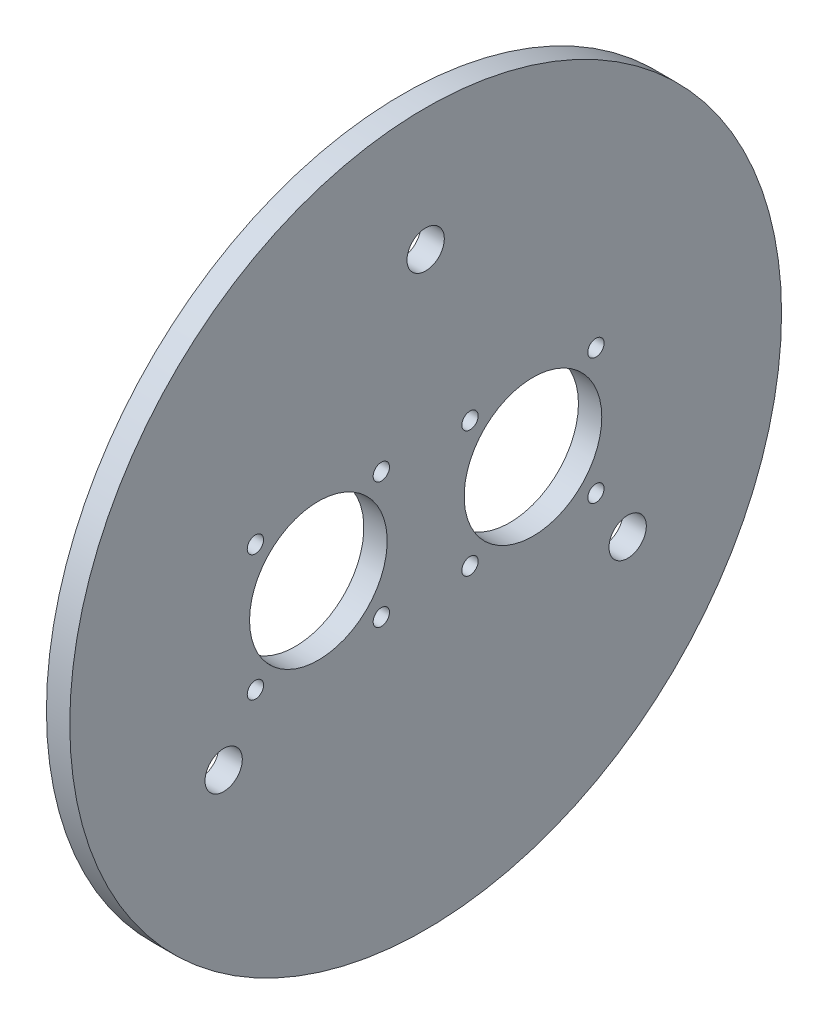
ISO-10303-21;
HEADER;
FILE_DESCRIPTION(('STEP AP214'),'2;1');
FILE_NAME('part.step','',(''),(''),'','','');
FILE_SCHEMA(('AUTOMOTIVE_DESIGN { 1 0 10303 214 1 1 1 1 }'));
ENDSEC;
DATA;
#1=APPLICATION_CONTEXT('core data for automotive mechanical design processes');
#2=APPLICATION_PROTOCOL_DEFINITION('international standard','automotive_design',2000,#1);
#3=PRODUCT_CONTEXT('',#1,'mechanical');
#4=PRODUCT('Part','Part','',(#3));
#5=PRODUCT_RELATED_PRODUCT_CATEGORY('part','',(#4));
#6=PRODUCT_DEFINITION_FORMATION('','',#4);
#7=PRODUCT_DEFINITION_CONTEXT('part definition',#1,'design');
#8=PRODUCT_DEFINITION('design','',#6,#7);
#9=PRODUCT_DEFINITION_SHAPE('','',#8);
#10=(LENGTH_UNIT() NAMED_UNIT(*) SI_UNIT(.MILLI.,.METRE.));
#11=(NAMED_UNIT(*) PLANE_ANGLE_UNIT() SI_UNIT($,.RADIAN.));
#12=(NAMED_UNIT(*) SI_UNIT($,.STERADIAN.) SOLID_ANGLE_UNIT());
#13=UNCERTAINTY_MEASURE_WITH_UNIT(LENGTH_MEASURE(1.E-05),#10,'distance_accuracy_value','');
#14=(GEOMETRIC_REPRESENTATION_CONTEXT(3) GLOBAL_UNCERTAINTY_ASSIGNED_CONTEXT((#13)) GLOBAL_UNIT_ASSIGNED_CONTEXT((#10,
#11,#12)) REPRESENTATION_CONTEXT('',''));
#15=CARTESIAN_POINT('',(0.,0.,0.));
#16=DIRECTION('',(0.,0.,1.));
#17=DIRECTION('',(1.,0.,0.));
#18=AXIS2_PLACEMENT_3D('',#15,#16,#17);
#19=CARTESIAN_POINT('',(5.,0.,0.));
#20=DIRECTION('',(1.,0.,0.));
#21=DIRECTION('',(0.,0.,-1.));
#22=AXIS2_PLACEMENT_3D('',#19,#20,#21);
#23=PLANE('',#22);
#24=CARTESIAN_POINT('',(5.,13.4969006858982,9.50309931410175));
#25=DIRECTION('',(1.,0.,0.));
#26=DIRECTION('',(0.,0.,1.));
#27=AXIS2_PLACEMENT_3D('',#24,#25,#26);
#28=CIRCLE('',#27,1.75000000000001);
#29=CARTESIAN_POINT('',(5.,13.4969006858982,11.2530993141018));
#30=VERTEX_POINT('',#29);
#31=EDGE_CURVE('E107',#30,#30,#28,.T.);
#32=ORIENTED_EDGE('',*,*,#31,.F.);
#33=EDGE_LOOP('',(#32));
#34=FACE_BOUND('',#33,.T.);
#35=CARTESIAN_POINT('',(5.,13.4969006858982,-9.50309931410175));
#36=DIRECTION('',(1.,0.,0.));
#37=DIRECTION('',(0.,0.,-1.));
#38=AXIS2_PLACEMENT_3D('',#35,#36,#37);
#39=CIRCLE('',#38,1.75000000000001);
#40=CARTESIAN_POINT('',(5.,13.4969006858982,-11.2530993141018));
#41=VERTEX_POINT('',#40);
#42=EDGE_CURVE('E95',#41,#41,#39,.T.);
#43=ORIENTED_EDGE('',*,*,#42,.F.);
#44=EDGE_LOOP('',(#43));
#45=FACE_BOUND('',#44,.T.);
#46=CARTESIAN_POINT('',(5.,-13.4969006858982,-36.4969006858983));
#47=DIRECTION('',(1.,0.,0.));
#48=DIRECTION('',(0.,0.,-1.));
#49=AXIS2_PLACEMENT_3D('',#46,#47,#48);
#50=CIRCLE('',#49,1.75);
#51=CARTESIAN_POINT('',(5.,-13.4969006858982,-38.2469006858983));
#52=VERTEX_POINT('',#51);
#53=EDGE_CURVE('E83',#52,#52,#50,.T.);
#54=ORIENTED_EDGE('',*,*,#53,.F.);
#55=EDGE_LOOP('',(#54));
#56=FACE_BOUND('',#55,.T.);
#57=CARTESIAN_POINT('',(5.,13.4969006858983,-36.4969006858982));
#58=DIRECTION('',(1.,0.,0.));
#59=DIRECTION('',(0.,0.,-1.));
#60=AXIS2_PLACEMENT_3D('',#57,#58,#59);
#61=CIRCLE('',#60,1.75);
#62=CARTESIAN_POINT('',(5.,13.4969006858983,-38.2469006858982));
#63=VERTEX_POINT('',#62);
#64=EDGE_CURVE('E71',#63,#63,#61,.T.);
#65=ORIENTED_EDGE('',*,*,#64,.F.);
#66=EDGE_LOOP('',(#65));
#67=FACE_BOUND('',#66,.T.);
#68=CARTESIAN_POINT('',(5.,0.,-23.));
#69=DIRECTION('',(1.,0.,0.));
#70=DIRECTION('',(0.,0.,-1.));
#71=AXIS2_PLACEMENT_3D('',#68,#69,#70);
#72=CIRCLE('',#71,14.75);
#73=CARTESIAN_POINT('',(5.,0.,-37.75));
#74=VERTEX_POINT('',#73);
#75=EDGE_CURVE('E59',#74,#74,#72,.T.);
#76=ORIENTED_EDGE('',*,*,#75,.F.);
#77=EDGE_LOOP('',(#76));
#78=FACE_BOUND('',#77,.T.);
#79=CARTESIAN_POINT('',(5.,-25.,-43.3012701892219));
#80=DIRECTION('',(1.,0.,0.));
#81=DIRECTION('',(0.,0.,-1.));
#82=AXIS2_PLACEMENT_3D('',#79,#80,#81);
#83=CIRCLE('',#82,4.00000000000001);
#84=CARTESIAN_POINT('',(5.,-25.,-47.301270189222));
#85=VERTEX_POINT('',#84);
#86=EDGE_CURVE('E47',#85,#85,#83,.T.);
#87=ORIENTED_EDGE('',*,*,#86,.F.);
#88=EDGE_LOOP('',(#87));
#89=FACE_BOUND('',#88,.T.);
#90=CARTESIAN_POINT('',(5.,0.,0.));
#91=DIRECTION('',(1.,0.,0.));
#92=DIRECTION('',(0.,0.,-1.));
#93=AXIS2_PLACEMENT_3D('',#90,#91,#92);
#94=CIRCLE('',#93,76.29);
#95=CARTESIAN_POINT('',(5.,0.,-76.29));
#96=VERTEX_POINT('',#95);
#97=EDGE_CURVE('E10',#96,#96,#94,.T.);
#98=ORIENTED_EDGE('',*,*,#97,.T.);
#99=EDGE_LOOP('',(#98));
#100=FACE_BOUND('',#99,.T.);
#101=CARTESIAN_POINT('',(5.,50.,0.));
#102=DIRECTION('',(1.,0.,0.));
#103=DIRECTION('',(0.,0.,-1.));
#104=AXIS2_PLACEMENT_3D('',#101,#102,#103);
#105=CIRCLE('',#104,4.00000000000001);
#106=CARTESIAN_POINT('',(5.,50.,-4.00000000000001));
#107=VERTEX_POINT('',#106);
#108=EDGE_CURVE('E42',#107,#107,#105,.T.);
#109=ORIENTED_EDGE('',*,*,#108,.F.);
#110=EDGE_LOOP('',(#109));
#111=FACE_BOUND('',#110,.T.);
#112=CARTESIAN_POINT('',(5.,-25.,43.3012701892219));
#113=DIRECTION('',(1.,0.,0.));
#114=DIRECTION('',(0.,0.,-1.));
#115=AXIS2_PLACEMENT_3D('',#112,#113,#114);
#116=CIRCLE('',#115,4.00000000000001);
#117=CARTESIAN_POINT('',(5.,-25.,39.3012701892219));
#118=VERTEX_POINT('',#117);
#119=EDGE_CURVE('E53',#118,#118,#116,.T.);
#120=ORIENTED_EDGE('',*,*,#119,.F.);
#121=EDGE_LOOP('',(#120));
#122=FACE_BOUND('',#121,.T.);
#123=CARTESIAN_POINT('',(5.,-13.4969006858982,36.4969006858983));
#124=DIRECTION('',(1.,0.,0.));
#125=DIRECTION('',(0.,0.,1.));
#126=AXIS2_PLACEMENT_3D('',#123,#124,#125);
#127=CIRCLE('',#126,1.75);
#128=CARTESIAN_POINT('',(5.,-13.4969006858982,38.2469006858983));
#129=VERTEX_POINT('',#128);
#130=EDGE_CURVE('E65',#129,#129,#127,.T.);
#131=ORIENTED_EDGE('',*,*,#130,.F.);
#132=EDGE_LOOP('',(#131));
#133=FACE_BOUND('',#132,.T.);
#134=CARTESIAN_POINT('',(5.,0.,23.));
#135=DIRECTION('',(1.,0.,0.));
#136=DIRECTION('',(0.,0.,1.));
#137=AXIS2_PLACEMENT_3D('',#134,#135,#136);
#138=CIRCLE('',#137,14.75);
#139=CARTESIAN_POINT('',(5.,0.,37.75));
#140=VERTEX_POINT('',#139);
#141=EDGE_CURVE('E77',#140,#140,#138,.T.);
#142=ORIENTED_EDGE('',*,*,#141,.F.);
#143=EDGE_LOOP('',(#142));
#144=FACE_BOUND('',#143,.T.);
#145=CARTESIAN_POINT('',(5.,-13.4969006858982,-9.5030993141018));
#146=DIRECTION('',(1.,0.,0.));
#147=DIRECTION('',(0.,0.,-1.));
#148=AXIS2_PLACEMENT_3D('',#145,#146,#147);
#149=CIRCLE('',#148,1.75000000000001);
#150=CARTESIAN_POINT('',(5.,-13.4969006858982,-11.2530993141018));
#151=VERTEX_POINT('',#150);
#152=EDGE_CURVE('E89',#151,#151,#149,.T.);
#153=ORIENTED_EDGE('',*,*,#152,.F.);
#154=EDGE_LOOP('',(#153));
#155=FACE_BOUND('',#154,.T.);
#156=CARTESIAN_POINT('',(5.,-13.4969006858982,9.5030993141018));
#157=DIRECTION('',(1.,0.,0.));
#158=DIRECTION('',(0.,0.,1.));
#159=AXIS2_PLACEMENT_3D('',#156,#157,#158);
#160=CIRCLE('',#159,1.75000000000001);
#161=CARTESIAN_POINT('',(5.,-13.4969006858982,11.2530993141018));
#162=VERTEX_POINT('',#161);
#163=EDGE_CURVE('E101',#162,#162,#160,.T.);
#164=ORIENTED_EDGE('',*,*,#163,.F.);
#165=EDGE_LOOP('',(#164));
#166=FACE_BOUND('',#165,.T.);
#167=CARTESIAN_POINT('',(5.,13.4969006858983,36.4969006858982));
#168=DIRECTION('',(1.,0.,0.));
#169=DIRECTION('',(0.,0.,1.));
#170=AXIS2_PLACEMENT_3D('',#167,#168,#169);
#171=CIRCLE('',#170,1.75);
#172=CARTESIAN_POINT('',(5.,13.4969006858983,38.2469006858982));
#173=VERTEX_POINT('',#172);
#174=EDGE_CURVE('E113',#173,#173,#171,.T.);
#175=ORIENTED_EDGE('',*,*,#174,.F.);
#176=EDGE_LOOP('',(#175));
#177=FACE_BOUND('',#176,.T.);
#178=ADVANCED_FACE('F31',(#34,#45,#56,#67,#78,#89,#100,#111,#122,#133,#144,#155,#166,#177),#23,.T.);
#179=CARTESIAN_POINT('',(0.,0.,0.));
#180=DIRECTION('',(1.,0.,0.));
#181=DIRECTION('',(0.,0.,-1.));
#182=AXIS2_PLACEMENT_3D('',#179,#180,#181);
#183=PLANE('',#182);
#184=CARTESIAN_POINT('',(0.,0.,0.));
#185=DIRECTION('',(1.,0.,0.));
#186=DIRECTION('',(0.,0.,-1.));
#187=AXIS2_PLACEMENT_3D('',#184,#185,#186);
#188=CIRCLE('',#187,76.29);
#189=CARTESIAN_POINT('',(0.,0.,-76.29));
#190=VERTEX_POINT('',#189);
#191=EDGE_CURVE('E35',#190,#190,#188,.T.);
#192=ORIENTED_EDGE('',*,*,#191,.F.);
#193=EDGE_LOOP('',(#192));
#194=FACE_BOUND('',#193,.T.);
#195=CARTESIAN_POINT('',(0.,50.,0.));
#196=DIRECTION('',(1.,0.,0.));
#197=DIRECTION('',(0.,0.,-1.));
#198=AXIS2_PLACEMENT_3D('',#195,#196,#197);
#199=CIRCLE('',#198,4.00000000000001);
#200=CARTESIAN_POINT('',(0.,50.,-4.00000000000001));
#201=VERTEX_POINT('',#200);
#202=EDGE_CURVE('E44',#201,#201,#199,.T.);
#203=ORIENTED_EDGE('',*,*,#202,.T.);
#204=EDGE_LOOP('',(#203));
#205=FACE_BOUND('',#204,.T.);
#206=CARTESIAN_POINT('',(0.,-25.,-43.3012701892219));
#207=DIRECTION('',(1.,0.,0.));
#208=DIRECTION('',(0.,0.,-1.));
#209=AXIS2_PLACEMENT_3D('',#206,#207,#208);
#210=CIRCLE('',#209,4.00000000000001);
#211=CARTESIAN_POINT('',(0.,-25.,-47.301270189222));
#212=VERTEX_POINT('',#211);
#213=EDGE_CURVE('E50',#212,#212,#210,.T.);
#214=ORIENTED_EDGE('',*,*,#213,.T.);
#215=EDGE_LOOP('',(#214));
#216=FACE_BOUND('',#215,.T.);
#217=CARTESIAN_POINT('',(0.,-25.,43.3012701892219));
#218=DIRECTION('',(1.,0.,0.));
#219=DIRECTION('',(0.,0.,-1.));
#220=AXIS2_PLACEMENT_3D('',#217,#218,#219);
#221=CIRCLE('',#220,4.00000000000001);
#222=CARTESIAN_POINT('',(0.,-25.,39.3012701892219));
#223=VERTEX_POINT('',#222);
#224=EDGE_CURVE('E56',#223,#223,#221,.T.);
#225=ORIENTED_EDGE('',*,*,#224,.T.);
#226=EDGE_LOOP('',(#225));
#227=FACE_BOUND('',#226,.T.);
#228=CARTESIAN_POINT('',(0.,0.,-23.));
#229=DIRECTION('',(1.,0.,0.));
#230=DIRECTION('',(0.,0.,-1.));
#231=AXIS2_PLACEMENT_3D('',#228,#229,#230);
#232=CIRCLE('',#231,14.75);
#233=CARTESIAN_POINT('',(0.,0.,-37.75));
#234=VERTEX_POINT('',#233);
#235=EDGE_CURVE('E62',#234,#234,#232,.T.);
#236=ORIENTED_EDGE('',*,*,#235,.T.);
#237=EDGE_LOOP('',(#236));
#238=FACE_BOUND('',#237,.T.);
#239=CARTESIAN_POINT('',(0.,-13.4969006858982,36.4969006858983));
#240=DIRECTION('',(1.,0.,0.));
#241=DIRECTION('',(0.,0.,1.));
#242=AXIS2_PLACEMENT_3D('',#239,#240,#241);
#243=CIRCLE('',#242,1.75);
#244=CARTESIAN_POINT('',(0.,-13.4969006858982,38.2469006858983));
#245=VERTEX_POINT('',#244);
#246=EDGE_CURVE('E68',#245,#245,#243,.T.);
#247=ORIENTED_EDGE('',*,*,#246,.T.);
#248=EDGE_LOOP('',(#247));
#249=FACE_BOUND('',#248,.T.);
#250=CARTESIAN_POINT('',(0.,13.4969006858983,-36.4969006858982));
#251=DIRECTION('',(1.,0.,0.));
#252=DIRECTION('',(0.,0.,-1.));
#253=AXIS2_PLACEMENT_3D('',#250,#251,#252);
#254=CIRCLE('',#253,1.75);
#255=CARTESIAN_POINT('',(0.,13.4969006858983,-38.2469006858982));
#256=VERTEX_POINT('',#255);
#257=EDGE_CURVE('E74',#256,#256,#254,.T.);
#258=ORIENTED_EDGE('',*,*,#257,.T.);
#259=EDGE_LOOP('',(#258));
#260=FACE_BOUND('',#259,.T.);
#261=CARTESIAN_POINT('',(0.,0.,23.));
#262=DIRECTION('',(1.,0.,0.));
#263=DIRECTION('',(0.,0.,1.));
#264=AXIS2_PLACEMENT_3D('',#261,#262,#263);
#265=CIRCLE('',#264,14.75);
#266=CARTESIAN_POINT('',(0.,0.,37.75));
#267=VERTEX_POINT('',#266);
#268=EDGE_CURVE('E80',#267,#267,#265,.T.);
#269=ORIENTED_EDGE('',*,*,#268,.T.);
#270=EDGE_LOOP('',(#269));
#271=FACE_BOUND('',#270,.T.);
#272=CARTESIAN_POINT('',(0.,-13.4969006858982,-36.4969006858983));
#273=DIRECTION('',(1.,0.,0.));
#274=DIRECTION('',(0.,0.,-1.));
#275=AXIS2_PLACEMENT_3D('',#272,#273,#274);
#276=CIRCLE('',#275,1.75);
#277=CARTESIAN_POINT('',(0.,-13.4969006858982,-38.2469006858983));
#278=VERTEX_POINT('',#277);
#279=EDGE_CURVE('E86',#278,#278,#276,.T.);
#280=ORIENTED_EDGE('',*,*,#279,.T.);
#281=EDGE_LOOP('',(#280));
#282=FACE_BOUND('',#281,.T.);
#283=CARTESIAN_POINT('',(0.,-13.4969006858982,-9.5030993141018));
#284=DIRECTION('',(1.,0.,0.));
#285=DIRECTION('',(0.,0.,-1.));
#286=AXIS2_PLACEMENT_3D('',#283,#284,#285);
#287=CIRCLE('',#286,1.75000000000001);
#288=CARTESIAN_POINT('',(0.,-13.4969006858982,-11.2530993141018));
#289=VERTEX_POINT('',#288);
#290=EDGE_CURVE('E92',#289,#289,#287,.T.);
#291=ORIENTED_EDGE('',*,*,#290,.T.);
#292=EDGE_LOOP('',(#291));
#293=FACE_BOUND('',#292,.T.);
#294=CARTESIAN_POINT('',(0.,13.4969006858982,-9.50309931410175));
#295=DIRECTION('',(1.,0.,0.));
#296=DIRECTION('',(0.,0.,-1.));
#297=AXIS2_PLACEMENT_3D('',#294,#295,#296);
#298=CIRCLE('',#297,1.75000000000001);
#299=CARTESIAN_POINT('',(0.,13.4969006858982,-11.2530993141018));
#300=VERTEX_POINT('',#299);
#301=EDGE_CURVE('E98',#300,#300,#298,.T.);
#302=ORIENTED_EDGE('',*,*,#301,.T.);
#303=EDGE_LOOP('',(#302));
#304=FACE_BOUND('',#303,.T.);
#305=CARTESIAN_POINT('',(0.,-13.4969006858982,9.5030993141018));
#306=DIRECTION('',(1.,0.,0.));
#307=DIRECTION('',(0.,0.,1.));
#308=AXIS2_PLACEMENT_3D('',#305,#306,#307);
#309=CIRCLE('',#308,1.75000000000001);
#310=CARTESIAN_POINT('',(0.,-13.4969006858982,11.2530993141018));
#311=VERTEX_POINT('',#310);
#312=EDGE_CURVE('E104',#311,#311,#309,.T.);
#313=ORIENTED_EDGE('',*,*,#312,.T.);
#314=EDGE_LOOP('',(#313));
#315=FACE_BOUND('',#314,.T.);
#316=CARTESIAN_POINT('',(0.,13.4969006858982,9.50309931410175));
#317=DIRECTION('',(1.,0.,0.));
#318=DIRECTION('',(0.,0.,1.));
#319=AXIS2_PLACEMENT_3D('',#316,#317,#318);
#320=CIRCLE('',#319,1.75000000000001);
#321=CARTESIAN_POINT('',(0.,13.4969006858982,11.2530993141018));
#322=VERTEX_POINT('',#321);
#323=EDGE_CURVE('E110',#322,#322,#320,.T.);
#324=ORIENTED_EDGE('',*,*,#323,.T.);
#325=EDGE_LOOP('',(#324));
#326=FACE_BOUND('',#325,.T.);
#327=CARTESIAN_POINT('',(0.,13.4969006858983,36.4969006858982));
#328=DIRECTION('',(1.,0.,0.));
#329=DIRECTION('',(0.,0.,1.));
#330=AXIS2_PLACEMENT_3D('',#327,#328,#329);
#331=CIRCLE('',#330,1.75);
#332=CARTESIAN_POINT('',(0.,13.4969006858983,38.2469006858982));
#333=VERTEX_POINT('',#332);
#334=EDGE_CURVE('E116',#333,#333,#331,.T.);
#335=ORIENTED_EDGE('',*,*,#334,.T.);
#336=EDGE_LOOP('',(#335));
#337=FACE_BOUND('',#336,.T.);
#338=ADVANCED_FACE('F126',(#194,#205,#216,#227,#238,#249,#260,#271,#282,#293,#304,#315,#326,
#337),#183,.F.);
#339=CARTESIAN_POINT('',(5.,0.,0.));
#340=DIRECTION('',(-1.,0.,0.));
#341=DIRECTION('',(0.,0.,1.));
#342=AXIS2_PLACEMENT_3D('',#339,#340,#341);
#343=CYLINDRICAL_SURFACE('',#342,76.29);
#344=ORIENTED_EDGE('',*,*,#97,.F.);
#345=EDGE_LOOP('',(#344));
#346=FACE_BOUND('',#345,.T.);
#347=ORIENTED_EDGE('',*,*,#191,.T.);
#348=EDGE_LOOP('',(#347));
#349=FACE_BOUND('',#348,.T.);
#350=ADVANCED_FACE('F33',(#346,#349),#343,.T.);
#351=CARTESIAN_POINT('',(5.,50.,0.));
#352=DIRECTION('',(-1.,0.,0.));
#353=DIRECTION('',(0.,0.,1.));
#354=AXIS2_PLACEMENT_3D('',#351,#352,#353);
#355=CYLINDRICAL_SURFACE('',#354,4.00000000000001);
#356=ORIENTED_EDGE('',*,*,#108,.T.);
#357=EDGE_LOOP('',(#356));
#358=FACE_BOUND('',#357,.T.);
#359=ORIENTED_EDGE('',*,*,#202,.F.);
#360=EDGE_LOOP('',(#359));
#361=FACE_BOUND('',#360,.T.);
#362=ADVANCED_FACE('F136',(#358,#361),#355,.F.);
#363=CARTESIAN_POINT('',(5.,-25.,-43.3012701892219));
#364=DIRECTION('',(-1.,0.,0.));
#365=DIRECTION('',(0.,0.,1.));
#366=AXIS2_PLACEMENT_3D('',#363,#364,#365);
#367=CYLINDRICAL_SURFACE('',#366,4.00000000000001);
#368=ORIENTED_EDGE('',*,*,#86,.T.);
#369=EDGE_LOOP('',(#368));
#370=FACE_BOUND('',#369,.T.);
#371=ORIENTED_EDGE('',*,*,#213,.F.);
#372=EDGE_LOOP('',(#371));
#373=FACE_BOUND('',#372,.T.);
#374=ADVANCED_FACE('F139',(#370,#373),#367,.F.);
#375=CARTESIAN_POINT('',(5.,-25.,43.3012701892219));
#376=DIRECTION('',(-1.,0.,0.));
#377=DIRECTION('',(0.,0.,1.));
#378=AXIS2_PLACEMENT_3D('',#375,#376,#377);
#379=CYLINDRICAL_SURFACE('',#378,4.00000000000001);
#380=ORIENTED_EDGE('',*,*,#119,.T.);
#381=EDGE_LOOP('',(#380));
#382=FACE_BOUND('',#381,.T.);
#383=ORIENTED_EDGE('',*,*,#224,.F.);
#384=EDGE_LOOP('',(#383));
#385=FACE_BOUND('',#384,.T.);
#386=ADVANCED_FACE('F143',(#382,#385),#379,.F.);
#387=CARTESIAN_POINT('',(5.,0.,-23.));
#388=DIRECTION('',(-1.,0.,0.));
#389=DIRECTION('',(0.,0.,1.));
#390=AXIS2_PLACEMENT_3D('',#387,#388,#389);
#391=CYLINDRICAL_SURFACE('',#390,14.75);
#392=ORIENTED_EDGE('',*,*,#75,.T.);
#393=EDGE_LOOP('',(#392));
#394=FACE_BOUND('',#393,.T.);
#395=ORIENTED_EDGE('',*,*,#235,.F.);
#396=EDGE_LOOP('',(#395));
#397=FACE_BOUND('',#396,.T.);
#398=ADVANCED_FACE('F147',(#394,#397),#391,.F.);
#399=CARTESIAN_POINT('',(5.,-13.4969006858982,36.4969006858983));
#400=DIRECTION('',(-1.,0.,0.));
#401=DIRECTION('',(0.,0.,1.));
#402=AXIS2_PLACEMENT_3D('',#399,#400,#401);
#403=CYLINDRICAL_SURFACE('',#402,1.75);
#404=ORIENTED_EDGE('',*,*,#130,.T.);
#405=EDGE_LOOP('',(#404));
#406=FACE_BOUND('',#405,.T.);
#407=ORIENTED_EDGE('',*,*,#246,.F.);
#408=EDGE_LOOP('',(#407));
#409=FACE_BOUND('',#408,.T.);
#410=ADVANCED_FACE('F151',(#406,#409),#403,.F.);
#411=CARTESIAN_POINT('',(5.,13.4969006858983,-36.4969006858982));
#412=DIRECTION('',(-1.,0.,0.));
#413=DIRECTION('',(0.,0.,1.));
#414=AXIS2_PLACEMENT_3D('',#411,#412,#413);
#415=CYLINDRICAL_SURFACE('',#414,1.75);
#416=ORIENTED_EDGE('',*,*,#64,.T.);
#417=EDGE_LOOP('',(#416));
#418=FACE_BOUND('',#417,.T.);
#419=ORIENTED_EDGE('',*,*,#257,.F.);
#420=EDGE_LOOP('',(#419));
#421=FACE_BOUND('',#420,.T.);
#422=ADVANCED_FACE('F155',(#418,#421),#415,.F.);
#423=CARTESIAN_POINT('',(5.,0.,23.));
#424=DIRECTION('',(-1.,0.,0.));
#425=DIRECTION('',(0.,0.,1.));
#426=AXIS2_PLACEMENT_3D('',#423,#424,#425);
#427=CYLINDRICAL_SURFACE('',#426,14.75);
#428=ORIENTED_EDGE('',*,*,#141,.T.);
#429=EDGE_LOOP('',(#428));
#430=FACE_BOUND('',#429,.T.);
#431=ORIENTED_EDGE('',*,*,#268,.F.);
#432=EDGE_LOOP('',(#431));
#433=FACE_BOUND('',#432,.T.);
#434=ADVANCED_FACE('F159',(#430,#433),#427,.F.);
#435=CARTESIAN_POINT('',(5.,-13.4969006858982,-36.4969006858983));
#436=DIRECTION('',(-1.,0.,0.));
#437=DIRECTION('',(0.,0.,1.));
#438=AXIS2_PLACEMENT_3D('',#435,#436,#437);
#439=CYLINDRICAL_SURFACE('',#438,1.75);
#440=ORIENTED_EDGE('',*,*,#53,.T.);
#441=EDGE_LOOP('',(#440));
#442=FACE_BOUND('',#441,.T.);
#443=ORIENTED_EDGE('',*,*,#279,.F.);
#444=EDGE_LOOP('',(#443));
#445=FACE_BOUND('',#444,.T.);
#446=ADVANCED_FACE('F163',(#442,#445),#439,.F.);
#447=CARTESIAN_POINT('',(5.,-13.4969006858982,-9.5030993141018));
#448=DIRECTION('',(-1.,0.,0.));
#449=DIRECTION('',(0.,0.,1.));
#450=AXIS2_PLACEMENT_3D('',#447,#448,#449);
#451=CYLINDRICAL_SURFACE('',#450,1.75000000000001);
#452=ORIENTED_EDGE('',*,*,#152,.T.);
#453=EDGE_LOOP('',(#452));
#454=FACE_BOUND('',#453,.T.);
#455=ORIENTED_EDGE('',*,*,#290,.F.);
#456=EDGE_LOOP('',(#455));
#457=FACE_BOUND('',#456,.T.);
#458=ADVANCED_FACE('F167',(#454,#457),#451,.F.);
#459=CARTESIAN_POINT('',(5.,13.4969006858982,-9.50309931410175));
#460=DIRECTION('',(-1.,0.,0.));
#461=DIRECTION('',(0.,0.,1.));
#462=AXIS2_PLACEMENT_3D('',#459,#460,#461);
#463=CYLINDRICAL_SURFACE('',#462,1.75000000000001);
#464=ORIENTED_EDGE('',*,*,#42,.T.);
#465=EDGE_LOOP('',(#464));
#466=FACE_BOUND('',#465,.T.);
#467=ORIENTED_EDGE('',*,*,#301,.F.);
#468=EDGE_LOOP('',(#467));
#469=FACE_BOUND('',#468,.T.);
#470=ADVANCED_FACE('F171',(#466,#469),#463,.F.);
#471=CARTESIAN_POINT('',(5.,-13.4969006858982,9.5030993141018));
#472=DIRECTION('',(-1.,0.,0.));
#473=DIRECTION('',(0.,0.,1.));
#474=AXIS2_PLACEMENT_3D('',#471,#472,#473);
#475=CYLINDRICAL_SURFACE('',#474,1.75000000000001);
#476=ORIENTED_EDGE('',*,*,#163,.T.);
#477=EDGE_LOOP('',(#476));
#478=FACE_BOUND('',#477,.T.);
#479=ORIENTED_EDGE('',*,*,#312,.F.);
#480=EDGE_LOOP('',(#479));
#481=FACE_BOUND('',#480,.T.);
#482=ADVANCED_FACE('F175',(#478,#481),#475,.F.);
#483=CARTESIAN_POINT('',(5.,13.4969006858982,9.50309931410175));
#484=DIRECTION('',(-1.,0.,0.));
#485=DIRECTION('',(0.,0.,1.));
#486=AXIS2_PLACEMENT_3D('',#483,#484,#485);
#487=CYLINDRICAL_SURFACE('',#486,1.75000000000001);
#488=ORIENTED_EDGE('',*,*,#31,.T.);
#489=EDGE_LOOP('',(#488));
#490=FACE_BOUND('',#489,.T.);
#491=ORIENTED_EDGE('',*,*,#323,.F.);
#492=EDGE_LOOP('',(#491));
#493=FACE_BOUND('',#492,.T.);
#494=ADVANCED_FACE('F179',(#490,#493),#487,.F.);
#495=CARTESIAN_POINT('',(5.,13.4969006858983,36.4969006858982));
#496=DIRECTION('',(-1.,0.,0.));
#497=DIRECTION('',(0.,0.,1.));
#498=AXIS2_PLACEMENT_3D('',#495,#496,#497);
#499=CYLINDRICAL_SURFACE('',#498,1.75);
#500=ORIENTED_EDGE('',*,*,#174,.T.);
#501=EDGE_LOOP('',(#500));
#502=FACE_BOUND('',#501,.T.);
#503=ORIENTED_EDGE('',*,*,#334,.F.);
#504=EDGE_LOOP('',(#503));
#505=FACE_BOUND('',#504,.T.);
#506=ADVANCED_FACE('F122',(#502,#505),#499,.F.);
#507=CLOSED_SHELL('',(#178,#338,#350,#362,#374,#386,#398,#410,#422,#434,#446,#458,#470,#482,
#494,#506));
#508=MANIFOLD_SOLID_BREP('B2',#507);
#509=ADVANCED_BREP_SHAPE_REPRESENTATION('',(#18,#508),#14);
#510=SHAPE_DEFINITION_REPRESENTATION(#9,#509);
ENDSEC;
END-ISO-10303-21;
